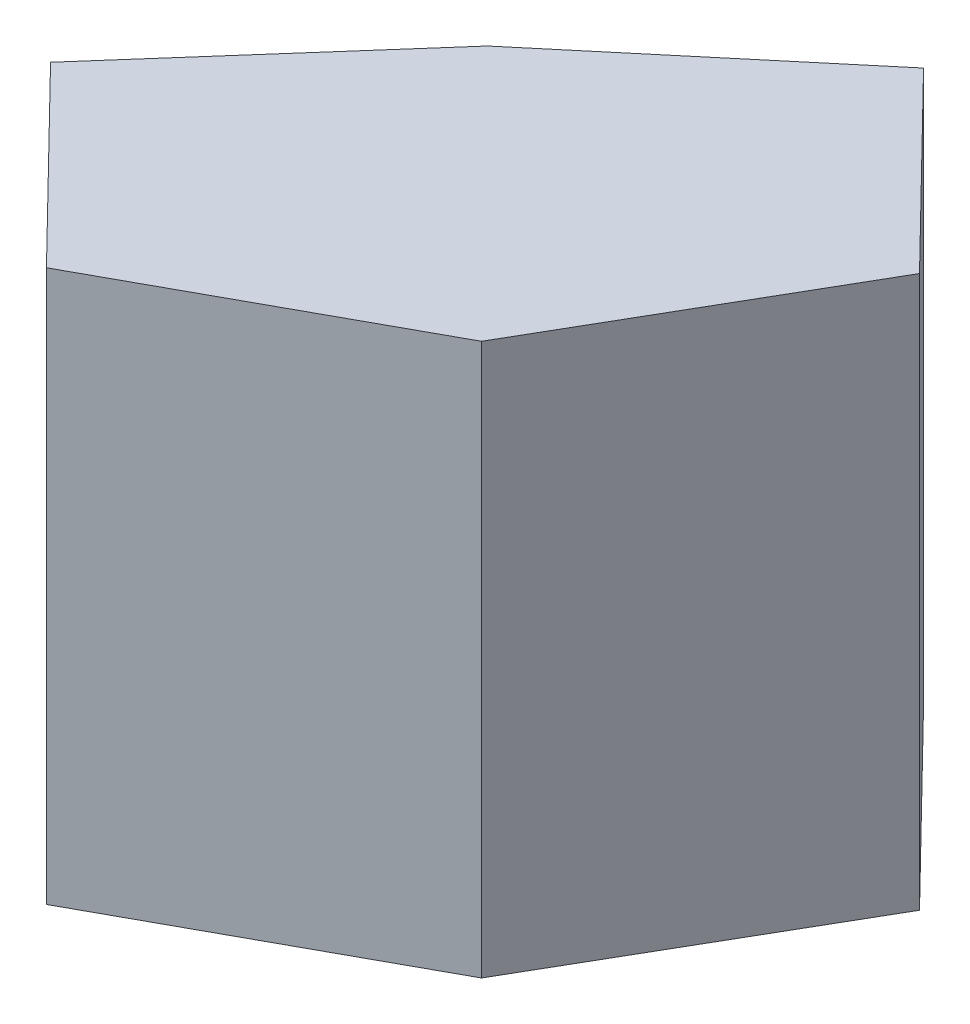
ISO-10303-21;
HEADER;
FILE_DESCRIPTION(('STEP AP214'),'2;1');
FILE_NAME('part.step','',(''),(''),'','','');
FILE_SCHEMA(('AUTOMOTIVE_DESIGN { 1 0 10303 214 1 1 1 1 }'));
ENDSEC;
DATA;
#1=APPLICATION_CONTEXT('core data for automotive mechanical design processes');
#2=APPLICATION_PROTOCOL_DEFINITION('international standard','automotive_design',2000,#1);
#3=PRODUCT_CONTEXT('',#1,'mechanical');
#4=PRODUCT('Part','Part','',(#3));
#5=PRODUCT_RELATED_PRODUCT_CATEGORY('part','',(#4));
#6=PRODUCT_DEFINITION_FORMATION('','',#4);
#7=PRODUCT_DEFINITION_CONTEXT('part definition',#1,'design');
#8=PRODUCT_DEFINITION('design','',#6,#7);
#9=PRODUCT_DEFINITION_SHAPE('','',#8);
#10=(LENGTH_UNIT() NAMED_UNIT(*) SI_UNIT(.MILLI.,.METRE.));
#11=(NAMED_UNIT(*) PLANE_ANGLE_UNIT() SI_UNIT($,.RADIAN.));
#12=(NAMED_UNIT(*) SI_UNIT($,.STERADIAN.) SOLID_ANGLE_UNIT());
#13=UNCERTAINTY_MEASURE_WITH_UNIT(LENGTH_MEASURE(1.E-05),#10,'distance_accuracy_value','');
#14=(GEOMETRIC_REPRESENTATION_CONTEXT(3) GLOBAL_UNCERTAINTY_ASSIGNED_CONTEXT((#13)) GLOBAL_UNIT_ASSIGNED_CONTEXT((#10,
#11,#12)) REPRESENTATION_CONTEXT('',''));
#15=CARTESIAN_POINT('',(0.,0.,0.));
#16=DIRECTION('',(0.,0.,1.));
#17=DIRECTION('',(1.,0.,0.));
#18=AXIS2_PLACEMENT_3D('',#15,#16,#17);
#19=CARTESIAN_POINT('',(-8.65029030985652,6.5,14.9827423168922));
#20=DIRECTION('',(-0.715117637602513,0.,0.69900412329957));
#21=DIRECTION('',(0.69900412329957,0.,0.715117637602513));
#22=AXIS2_PLACEMENT_3D('',#19,#20,#21);
#23=PLANE('',#22);
#24=DIRECTION('',(-0.69900412329957,0.,-0.715117637602513));
#25=VECTOR('',#24,1.);
#26=CARTESIAN_POINT('',(-8.65029030985652,-6.5,14.9827423168922));
#27=LINE('',#26,#25);
#28=CARTESIAN_POINT('',(-8.65029030985652,-6.5,14.9827423168922));
#29=VERTEX_POINT('',#28);
#30=CARTESIAN_POINT('',(-12.7983340868303,-6.5,10.7390774119428));
#31=VERTEX_POINT('',#30);
#32=EDGE_CURVE('E114',#29,#31,#27,.T.);
#33=ORIENTED_EDGE('',*,*,#32,.T.);
#34=DIRECTION('',(0.,-1.,0.));
#35=VECTOR('',#34,1.);
#36=CARTESIAN_POINT('',(-12.7983340868303,6.5,10.7390774119428));
#37=LINE('',#36,#35);
#38=CARTESIAN_POINT('',(-12.7983340868303,6.5,10.7390774119428));
#39=VERTEX_POINT('',#38);
#40=EDGE_CURVE('E11',#39,#31,#37,.T.);
#41=ORIENTED_EDGE('',*,*,#40,.F.);
#42=DIRECTION('',(-0.69900412329957,0.,-0.715117637602513));
#43=VECTOR('',#42,1.);
#44=CARTESIAN_POINT('',(-8.65029030985652,6.5,14.9827423168922));
#45=LINE('',#44,#43);
#46=CARTESIAN_POINT('',(-8.65029030985652,6.5,14.9827423168922));
#47=VERTEX_POINT('',#46);
#48=EDGE_CURVE('E131',#47,#39,#45,.T.);
#49=ORIENTED_EDGE('',*,*,#48,.F.);
#50=DIRECTION('',(0.,-1.,0.));
#51=VECTOR('',#50,1.);
#52=CARTESIAN_POINT('',(-8.65029030985652,6.5,14.9827423168922));
#53=LINE('',#52,#51);
#54=EDGE_CURVE('E47',#47,#29,#53,.T.);
#55=ORIENTED_EDGE('',*,*,#54,.T.);
#56=EDGE_LOOP('',(#33,#41,#49,#55));
#57=FACE_BOUND('',#56,.T.);
#58=ADVANCED_FACE('F39',(#57),#23,.F.);
#59=CARTESIAN_POINT('',(-12.7983340868303,6.5,10.7390774119428));
#60=DIRECTION('',(0.642787609686535,0.,0.766044443118981));
#61=DIRECTION('',(0.766044443118981,0.,-0.642787609686535));
#62=AXIS2_PLACEMENT_3D('',#59,#60,#61);
#63=PLANE('',#62);
#64=DIRECTION('',(-0.766044443118981,0.,0.642787609686535));
#65=VECTOR('',#64,1.);
#66=CARTESIAN_POINT('',(-12.7983340868303,-6.5,10.7390774119428));
#67=LINE('',#66,#65);
#68=CARTESIAN_POINT('',(-18.3890627700506,-6.5,15.4302557880451));
#69=VERTEX_POINT('',#68);
#70=EDGE_CURVE('E137',#31,#69,#67,.T.);
#71=ORIENTED_EDGE('',*,*,#70,.T.);
#72=DIRECTION('',(0.,-1.,0.));
#73=VECTOR('',#72,1.);
#74=CARTESIAN_POINT('',(-18.3890627700506,6.5,15.4302557880451));
#75=LINE('',#74,#73);
#76=CARTESIAN_POINT('',(-18.3890627700506,6.5,15.4302557880451));
#77=VERTEX_POINT('',#76);
#78=EDGE_CURVE('E115',#77,#69,#75,.T.);
#79=ORIENTED_EDGE('',*,*,#78,.F.);
#80=DIRECTION('',(-0.766044443118981,0.,0.642787609686535));
#81=VECTOR('',#80,1.);
#82=CARTESIAN_POINT('',(-12.7983340868303,6.5,10.7390774119428));
#83=LINE('',#82,#81);
#84=EDGE_CURVE('E79',#39,#77,#83,.T.);
#85=ORIENTED_EDGE('',*,*,#84,.F.);
#86=ORIENTED_EDGE('',*,*,#40,.T.);
#87=EDGE_LOOP('',(#71,#79,#85,#86));
#88=FACE_BOUND('',#87,.T.);
#89=ADVANCED_FACE('F146',(#88),#63,.F.);
#90=CARTESIAN_POINT('',(-12.4293684892744,6.5,21.5282977294188));
#91=DIRECTION('',(-0.866025403784439,0.,-0.5));
#92=DIRECTION('',(-0.5,0.,0.866025403784439));
#93=AXIS2_PLACEMENT_3D('',#90,#91,#92);
#94=PLANE('',#93);
#95=DIRECTION('',(0.5,0.,-0.866025403784439));
#96=VECTOR('',#95,1.);
#97=CARTESIAN_POINT('',(-12.4293684892744,-6.5,21.5282977294188));
#98=LINE('',#97,#96);
#99=CARTESIAN_POINT('',(-12.4293684892744,-6.5,21.5282977294188));
#100=VERTEX_POINT('',#99);
#101=EDGE_CURVE('E72',#100,#29,#98,.T.);
#102=ORIENTED_EDGE('',*,*,#101,.T.);
#103=ORIENTED_EDGE('',*,*,#54,.F.);
#104=DIRECTION('',(0.5,0.,-0.866025403784439));
#105=VECTOR('',#104,1.);
#106=CARTESIAN_POINT('',(-12.4293684892744,6.5,21.5282977294188));
#107=LINE('',#106,#105);
#108=CARTESIAN_POINT('',(-12.4293684892744,6.5,21.5282977294188));
#109=VERTEX_POINT('',#108);
#110=EDGE_CURVE('E55',#109,#47,#107,.T.);
#111=ORIENTED_EDGE('',*,*,#110,.F.);
#112=DIRECTION('',(0.,-1.,0.));
#113=VECTOR('',#112,1.);
#114=CARTESIAN_POINT('',(-12.4293684892744,6.5,21.5282977294188));
#115=LINE('',#114,#113);
#116=EDGE_CURVE('E69',#109,#100,#115,.T.);
#117=ORIENTED_EDGE('',*,*,#116,.T.);
#118=EDGE_LOOP('',(#102,#103,#111,#117));
#119=FACE_BOUND('',#118,.T.);
#120=ADVANCED_FACE('F148',(#119),#94,.F.);
#121=CARTESIAN_POINT('',(0.,6.5,0.));
#122=DIRECTION('',(0.,1.,0.));
#123=DIRECTION('',(0.,0.,1.));
#124=AXIS2_PLACEMENT_3D('',#121,#122,#123);
#125=PLANE('',#124);
#126=ORIENTED_EDGE('',*,*,#48,.T.);
#127=ORIENTED_EDGE('',*,*,#84,.T.);
#128=DIRECTION('',(0.660194906999942,0.,-0.751094324816356));
#129=VECTOR('',#128,1.);
#130=CARTESIAN_POINT('',(-23.207282700023,6.5,20.9118758471342));
#131=LINE('',#130,#129);
#132=CARTESIAN_POINT('',(-23.207282700023,6.5,20.9118758471342));
#133=VERTEX_POINT('',#132);
#134=EDGE_CURVE('E96',#133,#77,#131,.T.);
#135=ORIENTED_EDGE('',*,*,#134,.F.);
#136=DIRECTION('',(-0.698891065697629,0.,-0.715228130240997));
#137=VECTOR('',#136,1.);
#138=CARTESIAN_POINT('',(-19.0599098316555,6.5,25.1561964396342));
#139=LINE('',#138,#137);
#140=CARTESIAN_POINT('',(-19.0599098316555,6.5,25.1561964396342));
#141=VERTEX_POINT('',#140);
#142=EDGE_CURVE('E100',#141,#133,#139,.T.);
#143=ORIENTED_EDGE('',*,*,#142,.F.);
#144=DIRECTION('',(-0.877269671013074,0.,0.479997837829103));
#145=VECTOR('',#144,1.);
#146=CARTESIAN_POINT('',(-12.4293684892744,6.5,21.5282977294188));
#147=LINE('',#146,#145);
#148=EDGE_CURVE('E104',#109,#141,#147,.T.);
#149=ORIENTED_EDGE('',*,*,#148,.F.);
#150=ORIENTED_EDGE('',*,*,#110,.T.);
#151=EDGE_LOOP('',(#126,#127,#135,#143,#149,#150));
#152=FACE_BOUND('',#151,.T.);
#153=ADVANCED_FACE('F98',(#152),#125,.T.);
#154=CARTESIAN_POINT('',(0.,-6.5,0.));
#155=DIRECTION('',(0.,1.,0.));
#156=DIRECTION('',(0.,0.,1.));
#157=AXIS2_PLACEMENT_3D('',#154,#155,#156);
#158=PLANE('',#157);
#159=ORIENTED_EDGE('',*,*,#32,.F.);
#160=ORIENTED_EDGE('',*,*,#101,.F.);
#161=DIRECTION('',(-0.877269671013074,0.,0.479997837829103));
#162=VECTOR('',#161,1.);
#163=CARTESIAN_POINT('',(-12.4293684892744,-6.5,21.5282977294188));
#164=LINE('',#163,#162);
#165=CARTESIAN_POINT('',(-19.0599098316555,-6.5,25.1561964396342));
#166=VERTEX_POINT('',#165);
#167=EDGE_CURVE('E120',#100,#166,#164,.T.);
#168=ORIENTED_EDGE('',*,*,#167,.T.);
#169=DIRECTION('',(-0.698891065697629,0.,-0.715228130240997));
#170=VECTOR('',#169,1.);
#171=CARTESIAN_POINT('',(-19.0599098316555,-6.5,25.1561964396342));
#172=LINE('',#171,#170);
#173=CARTESIAN_POINT('',(-23.207282700023,-6.5,20.9118758471342));
#174=VERTEX_POINT('',#173);
#175=EDGE_CURVE('E125',#166,#174,#172,.T.);
#176=ORIENTED_EDGE('',*,*,#175,.T.);
#177=DIRECTION('',(0.660194906999942,0.,-0.751094324816356));
#178=VECTOR('',#177,1.);
#179=CARTESIAN_POINT('',(-23.207282700023,-6.5,20.9118758471342));
#180=LINE('',#179,#178);
#181=EDGE_CURVE('E110',#174,#69,#180,.T.);
#182=ORIENTED_EDGE('',*,*,#181,.T.);
#183=ORIENTED_EDGE('',*,*,#70,.F.);
#184=EDGE_LOOP('',(#159,#160,#168,#176,#182,#183));
#185=FACE_BOUND('',#184,.T.);
#186=ADVANCED_FACE('F144',(#185),#158,.F.);
#187=CARTESIAN_POINT('',(-19.0599098316555,6.5,25.1561964396342));
#188=DIRECTION('',(0.715228130240997,0.,-0.698891065697629));
#189=DIRECTION('',(0.698891065697629,0.,0.715228130240997));
#190=AXIS2_PLACEMENT_3D('',#187,#188,#189);
#191=PLANE('',#190);
#192=ORIENTED_EDGE('',*,*,#175,.F.);
#193=DIRECTION('',(0.,-1.,0.));
#194=VECTOR('',#193,1.);
#195=CARTESIAN_POINT('',(-19.0599098316555,6.5,25.1561964396342));
#196=LINE('',#195,#194);
#197=EDGE_CURVE('E119',#141,#166,#196,.T.);
#198=ORIENTED_EDGE('',*,*,#197,.F.);
#199=ORIENTED_EDGE('',*,*,#142,.T.);
#200=DIRECTION('',(0.,-1.,0.));
#201=VECTOR('',#200,1.);
#202=CARTESIAN_POINT('',(-23.207282700023,6.5,20.9118758471342));
#203=LINE('',#202,#201);
#204=EDGE_CURVE('E107',#133,#174,#203,.T.);
#205=ORIENTED_EDGE('',*,*,#204,.T.);
#206=EDGE_LOOP('',(#192,#198,#199,#205));
#207=FACE_BOUND('',#206,.T.);
#208=ADVANCED_FACE('F117',(#207),#191,.F.);
#209=CARTESIAN_POINT('',(-23.207282700023,6.5,20.9118758471342));
#210=DIRECTION('',(0.751094324816356,0.,0.660194906999942));
#211=DIRECTION('',(-0.660194906999942,0.,0.751094324816356));
#212=AXIS2_PLACEMENT_3D('',#209,#210,#211);
#213=PLANE('',#212);
#214=ORIENTED_EDGE('',*,*,#181,.F.);
#215=ORIENTED_EDGE('',*,*,#204,.F.);
#216=ORIENTED_EDGE('',*,*,#134,.T.);
#217=ORIENTED_EDGE('',*,*,#78,.T.);
#218=EDGE_LOOP('',(#214,#215,#216,#217));
#219=FACE_BOUND('',#218,.T.);
#220=ADVANCED_FACE('F108',(#219),#213,.F.);
#221=CARTESIAN_POINT('',(-12.4293684892744,6.5,21.5282977294188));
#222=DIRECTION('',(-0.479997837829102,0.,-0.877269671013074));
#223=DIRECTION('',(0.877269671013074,0.,-0.479997837829103));
#224=AXIS2_PLACEMENT_3D('',#221,#222,#223);
#225=PLANE('',#224);
#226=ORIENTED_EDGE('',*,*,#167,.F.);
#227=ORIENTED_EDGE('',*,*,#116,.F.);
#228=ORIENTED_EDGE('',*,*,#148,.T.);
#229=ORIENTED_EDGE('',*,*,#197,.T.);
#230=EDGE_LOOP('',(#226,#227,#228,#229));
#231=FACE_BOUND('',#230,.T.);
#232=ADVANCED_FACE('F164',(#231),#225,.F.);
#233=CLOSED_SHELL('',(#58,#89,#120,#153,#186,#208,#220,#232));
#234=MANIFOLD_SOLID_BREP('B2',#233);
#235=ADVANCED_BREP_SHAPE_REPRESENTATION('',(#18,#234),#14);
#236=SHAPE_DEFINITION_REPRESENTATION(#9,#235);
ENDSEC;
END-ISO-10303-21;
